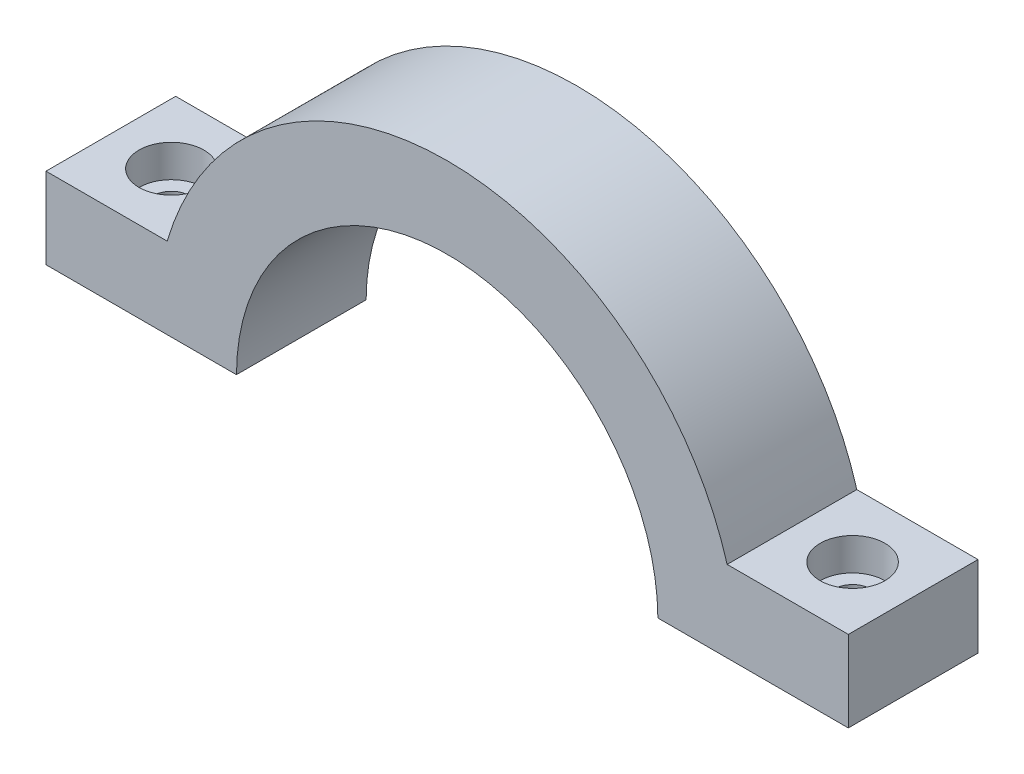
ISO-10303-21;
HEADER;
FILE_DESCRIPTION(('STEP AP214'),'2;1');
FILE_NAME('part.step','',(''),(''),'','','');
FILE_SCHEMA(('AUTOMOTIVE_DESIGN { 1 0 10303 214 1 1 1 1 }'));
ENDSEC;
DATA;
#1=APPLICATION_CONTEXT('core data for automotive mechanical design processes');
#2=APPLICATION_PROTOCOL_DEFINITION('international standard','automotive_design',2000,#1);
#3=PRODUCT_CONTEXT('',#1,'mechanical');
#4=PRODUCT('Part','Part','',(#3));
#5=PRODUCT_RELATED_PRODUCT_CATEGORY('part','',(#4));
#6=PRODUCT_DEFINITION_FORMATION('','',#4);
#7=PRODUCT_DEFINITION_CONTEXT('part definition',#1,'design');
#8=PRODUCT_DEFINITION('design','',#6,#7);
#9=PRODUCT_DEFINITION_SHAPE('','',#8);
#10=(LENGTH_UNIT() NAMED_UNIT(*) SI_UNIT(.MILLI.,.METRE.));
#11=(NAMED_UNIT(*) PLANE_ANGLE_UNIT() SI_UNIT($,.RADIAN.));
#12=(NAMED_UNIT(*) SI_UNIT($,.STERADIAN.) SOLID_ANGLE_UNIT());
#13=UNCERTAINTY_MEASURE_WITH_UNIT(LENGTH_MEASURE(1.E-05),#10,'distance_accuracy_value','');
#14=(GEOMETRIC_REPRESENTATION_CONTEXT(3) GLOBAL_UNCERTAINTY_ASSIGNED_CONTEXT((#13)) GLOBAL_UNIT_ASSIGNED_CONTEXT((#10,
#11,#12)) REPRESENTATION_CONTEXT('',''));
#15=CARTESIAN_POINT('',(0.,0.,0.));
#16=DIRECTION('',(0.,0.,1.));
#17=DIRECTION('',(1.,0.,0.));
#18=AXIS2_PLACEMENT_3D('',#15,#16,#17);
#19=CARTESIAN_POINT('',(0.,0.,-16.));
#20=DIRECTION('',(0.,0.,1.));
#21=DIRECTION('',(1.,0.,0.));
#22=AXIS2_PLACEMENT_3D('',#19,#20,#21);
#23=CYLINDRICAL_SURFACE('',#22,26.);
#24=CARTESIAN_POINT('',(0.,0.,0.));
#25=DIRECTION('',(0.,0.,-1.));
#26=DIRECTION('',(1.,0.,0.));
#27=AXIS2_PLACEMENT_3D('',#24,#25,#26);
#28=CIRCLE('',#27,26.);
#29=CARTESIAN_POINT('',(-25.9996995174944,0.125,0.));
#30=VERTEX_POINT('',#29);
#31=CARTESIAN_POINT('',(25.9996995174944,0.125,0.));
#32=VERTEX_POINT('',#31);
#33=EDGE_CURVE('E133',#30,#32,#28,.T.);
#34=ORIENTED_EDGE('',*,*,#33,.F.);
#35=DIRECTION('',(0.,0.,1.));
#36=VECTOR('',#35,1.);
#37=CARTESIAN_POINT('',(-25.9996995174944,0.125,-16.));
#38=LINE('',#37,#36);
#39=CARTESIAN_POINT('',(-25.9996995174944,0.125,-16.));
#40=VERTEX_POINT('',#39);
#41=EDGE_CURVE('E11',#40,#30,#38,.T.);
#42=ORIENTED_EDGE('',*,*,#41,.F.);
#43=CARTESIAN_POINT('',(0.,0.,-16.));
#44=DIRECTION('',(0.,0.,-1.));
#45=DIRECTION('',(1.,0.,0.));
#46=AXIS2_PLACEMENT_3D('',#43,#44,#45);
#47=CIRCLE('',#46,26.);
#48=CARTESIAN_POINT('',(25.9996995174944,0.125,-16.));
#49=VERTEX_POINT('',#48);
#50=EDGE_CURVE('E154',#40,#49,#47,.T.);
#51=ORIENTED_EDGE('',*,*,#50,.T.);
#52=DIRECTION('',(0.,0.,1.));
#53=VECTOR('',#52,1.);
#54=CARTESIAN_POINT('',(25.9996995174944,0.125,-16.));
#55=LINE('',#54,#53);
#56=EDGE_CURVE('E39',#49,#32,#55,.T.);
#57=ORIENTED_EDGE('',*,*,#56,.T.);
#58=EDGE_LOOP('',(#34,#42,#51,#57));
#59=FACE_BOUND('',#58,.T.);
#60=ADVANCED_FACE('F36',(#59),#23,.F.);
#61=CARTESIAN_POINT('',(-49.5,0.125,-16.));
#62=DIRECTION('',(0.,-1.,0.));
#63=DIRECTION('',(1.,0.,0.));
#64=AXIS2_PLACEMENT_3D('',#61,#62,#63);
#65=PLANE('',#64);
#66=CARTESIAN_POINT('',(-42.0234215993821,0.125,-8.));
#67=DIRECTION('',(0.,1.,0.));
#68=DIRECTION('',(0.,0.,1.));
#69=AXIS2_PLACEMENT_3D('',#66,#67,#68);
#70=CIRCLE('',#69,2.25);
#71=CARTESIAN_POINT('',(-42.0234215993821,0.125,-5.75000000000001));
#72=VERTEX_POINT('',#71);
#73=EDGE_CURVE('E224',#72,#72,#70,.T.);
#74=ORIENTED_EDGE('',*,*,#73,.T.);
#75=EDGE_LOOP('',(#74));
#76=FACE_BOUND('',#75,.T.);
#77=DIRECTION('',(1.,0.,0.));
#78=VECTOR('',#77,1.);
#79=CARTESIAN_POINT('',(-49.5,0.125,0.));
#80=LINE('',#79,#78);
#81=CARTESIAN_POINT('',(-49.5,0.125,0.));
#82=VERTEX_POINT('',#81);
#83=EDGE_CURVE('E152',#82,#30,#80,.T.);
#84=ORIENTED_EDGE('',*,*,#83,.F.);
#85=DIRECTION('',(0.,0.,1.));
#86=VECTOR('',#85,1.);
#87=CARTESIAN_POINT('',(-49.5,0.125,-16.));
#88=LINE('',#87,#86);
#89=CARTESIAN_POINT('',(-49.5,0.125,-16.));
#90=VERTEX_POINT('',#89);
#91=EDGE_CURVE('E45',#90,#82,#88,.T.);
#92=ORIENTED_EDGE('',*,*,#91,.F.);
#93=DIRECTION('',(1.,0.,0.));
#94=VECTOR('',#93,1.);
#95=CARTESIAN_POINT('',(-49.5,0.125,-16.));
#96=LINE('',#95,#94);
#97=EDGE_CURVE('E123',#90,#40,#96,.T.);
#98=ORIENTED_EDGE('',*,*,#97,.T.);
#99=ORIENTED_EDGE('',*,*,#41,.T.);
#100=EDGE_LOOP('',(#84,#92,#98,#99));
#101=FACE_BOUND('',#100,.T.);
#102=ADVANCED_FACE('F166',(#76,#101),#65,.T.);
#103=CARTESIAN_POINT('',(-49.5,0.125,-16.));
#104=DIRECTION('',(-1.,0.,0.));
#105=DIRECTION('',(0.,0.,1.));
#106=AXIS2_PLACEMENT_3D('',#103,#104,#105);
#107=PLANE('',#106);
#108=DIRECTION('',(0.,-1.,0.));
#109=VECTOR('',#108,1.);
#110=CARTESIAN_POINT('',(-49.5,0.125,0.));
#111=LINE('',#110,#109);
#112=CARTESIAN_POINT('',(-49.5,10.125,0.));
#113=VERTEX_POINT('',#112);
#114=EDGE_CURVE('E110',#113,#82,#111,.T.);
#115=ORIENTED_EDGE('',*,*,#114,.F.);
#116=DIRECTION('',(0.,0.,1.));
#117=VECTOR('',#116,1.);
#118=CARTESIAN_POINT('',(-49.5,10.125,-16.));
#119=LINE('',#118,#117);
#120=CARTESIAN_POINT('',(-49.5,10.125,-16.));
#121=VERTEX_POINT('',#120);
#122=EDGE_CURVE('E105',#121,#113,#119,.T.);
#123=ORIENTED_EDGE('',*,*,#122,.F.);
#124=DIRECTION('',(0.,-1.,0.));
#125=VECTOR('',#124,1.);
#126=CARTESIAN_POINT('',(-49.5,0.125,-16.));
#127=LINE('',#126,#125);
#128=EDGE_CURVE('E108',#121,#90,#127,.T.);
#129=ORIENTED_EDGE('',*,*,#128,.T.);
#130=ORIENTED_EDGE('',*,*,#91,.T.);
#131=EDGE_LOOP('',(#115,#123,#129,#130));
#132=FACE_BOUND('',#131,.T.);
#133=ADVANCED_FACE('F107',(#132),#107,.T.);
#134=CARTESIAN_POINT('',(-49.5,10.125,-16.));
#135=DIRECTION('',(0.,1.,0.));
#136=DIRECTION('',(0.,0.,1.));
#137=AXIS2_PLACEMENT_3D('',#134,#135,#136);
#138=PLANE('',#137);
#139=CARTESIAN_POINT('',(-42.0234215993821,10.125,-8.));
#140=DIRECTION('',(0.,1.,0.));
#141=DIRECTION('',(0.,0.,1.));
#142=AXIS2_PLACEMENT_3D('',#139,#140,#141);
#143=CIRCLE('',#142,4.);
#144=CARTESIAN_POINT('',(-42.0234215993821,10.125,-4.00000000000001));
#145=VERTEX_POINT('',#144);
#146=EDGE_CURVE('E232',#145,#145,#143,.T.);
#147=ORIENTED_EDGE('',*,*,#146,.F.);
#148=EDGE_LOOP('',(#147));
#149=FACE_BOUND('',#148,.T.);
#150=DIRECTION('',(-1.,0.,0.));
#151=VECTOR('',#150,1.);
#152=CARTESIAN_POINT('',(-49.5,10.125,0.));
#153=LINE('',#152,#151);
#154=CARTESIAN_POINT('',(-34.5468431987642,10.125,0.));
#155=VERTEX_POINT('',#154);
#156=EDGE_CURVE('E149',#155,#113,#153,.T.);
#157=ORIENTED_EDGE('',*,*,#156,.F.);
#158=DIRECTION('',(0.,0.,1.));
#159=VECTOR('',#158,1.);
#160=CARTESIAN_POINT('',(-34.5468431987642,10.125,-16.));
#161=LINE('',#160,#159);
#162=CARTESIAN_POINT('',(-34.5468431987642,10.125,-16.));
#163=VERTEX_POINT('',#162);
#164=EDGE_CURVE('E115',#163,#155,#161,.T.);
#165=ORIENTED_EDGE('',*,*,#164,.F.);
#166=DIRECTION('',(-1.,0.,0.));
#167=VECTOR('',#166,1.);
#168=CARTESIAN_POINT('',(-49.5,10.125,-16.));
#169=LINE('',#168,#167);
#170=EDGE_CURVE('E121',#163,#121,#169,.T.);
#171=ORIENTED_EDGE('',*,*,#170,.T.);
#172=ORIENTED_EDGE('',*,*,#122,.T.);
#173=EDGE_LOOP('',(#157,#165,#171,#172));
#174=FACE_BOUND('',#173,.T.);
#175=ADVANCED_FACE('F125',(#149,#174),#138,.T.);
#176=CARTESIAN_POINT('',(0.,0.,-16.));
#177=DIRECTION('',(0.,0.,1.));
#178=DIRECTION('',(1.,0.,0.));
#179=AXIS2_PLACEMENT_3D('',#176,#177,#178);
#180=CYLINDRICAL_SURFACE('',#179,36.);
#181=CARTESIAN_POINT('',(0.,0.,0.));
#182=DIRECTION('',(0.,0.,1.));
#183=DIRECTION('',(1.,0.,0.));
#184=AXIS2_PLACEMENT_3D('',#181,#182,#183);
#185=CIRCLE('',#184,36.);
#186=CARTESIAN_POINT('',(34.5468431987642,10.125,0.));
#187=VERTEX_POINT('',#186);
#188=EDGE_CURVE('E146',#187,#155,#185,.T.);
#189=ORIENTED_EDGE('',*,*,#188,.F.);
#190=DIRECTION('',(0.,0.,1.));
#191=VECTOR('',#190,1.);
#192=CARTESIAN_POINT('',(34.5468431987642,10.125,-16.));
#193=LINE('',#192,#191);
#194=CARTESIAN_POINT('',(34.5468431987642,10.125,-16.));
#195=VERTEX_POINT('',#194);
#196=EDGE_CURVE('E158',#195,#187,#193,.T.);
#197=ORIENTED_EDGE('',*,*,#196,.F.);
#198=CARTESIAN_POINT('',(0.,0.,-16.));
#199=DIRECTION('',(0.,0.,1.));
#200=DIRECTION('',(1.,0.,0.));
#201=AXIS2_PLACEMENT_3D('',#198,#199,#200);
#202=CIRCLE('',#201,36.);
#203=EDGE_CURVE('E126',#195,#163,#202,.T.);
#204=ORIENTED_EDGE('',*,*,#203,.T.);
#205=ORIENTED_EDGE('',*,*,#164,.T.);
#206=EDGE_LOOP('',(#189,#197,#204,#205));
#207=FACE_BOUND('',#206,.T.);
#208=ADVANCED_FACE('F181',(#207),#180,.T.);
#209=CARTESIAN_POINT('',(49.5,10.125,-16.));
#210=DIRECTION('',(0.,1.,0.));
#211=DIRECTION('',(0.,0.,1.));
#212=AXIS2_PLACEMENT_3D('',#209,#210,#211);
#213=PLANE('',#212);
#214=CARTESIAN_POINT('',(42.0234215993821,10.125,-8.));
#215=DIRECTION('',(0.,1.,0.));
#216=DIRECTION('',(0.,0.,1.));
#217=AXIS2_PLACEMENT_3D('',#214,#215,#216);
#218=CIRCLE('',#217,4.);
#219=CARTESIAN_POINT('',(42.0234215993821,10.125,-4.00000000000001));
#220=VERTEX_POINT('',#219);
#221=EDGE_CURVE('E221',#220,#220,#218,.T.);
#222=ORIENTED_EDGE('',*,*,#221,.F.);
#223=EDGE_LOOP('',(#222));
#224=FACE_BOUND('',#223,.T.);
#225=DIRECTION('',(-1.,0.,0.));
#226=VECTOR('',#225,1.);
#227=CARTESIAN_POINT('',(49.5,10.125,0.));
#228=LINE('',#227,#226);
#229=CARTESIAN_POINT('',(49.5,10.125,0.));
#230=VERTEX_POINT('',#229);
#231=EDGE_CURVE('E143',#230,#187,#228,.T.);
#232=ORIENTED_EDGE('',*,*,#231,.F.);
#233=DIRECTION('',(0.,0.,1.));
#234=VECTOR('',#233,1.);
#235=CARTESIAN_POINT('',(49.5,10.125,-16.));
#236=LINE('',#235,#234);
#237=CARTESIAN_POINT('',(49.5,10.125,-16.));
#238=VERTEX_POINT('',#237);
#239=EDGE_CURVE('E160',#238,#230,#236,.T.);
#240=ORIENTED_EDGE('',*,*,#239,.F.);
#241=DIRECTION('',(-1.,0.,0.));
#242=VECTOR('',#241,1.);
#243=CARTESIAN_POINT('',(49.5,10.125,-16.));
#244=LINE('',#243,#242);
#245=EDGE_CURVE('E128',#238,#195,#244,.T.);
#246=ORIENTED_EDGE('',*,*,#245,.T.);
#247=ORIENTED_EDGE('',*,*,#196,.T.);
#248=EDGE_LOOP('',(#232,#240,#246,#247));
#249=FACE_BOUND('',#248,.T.);
#250=ADVANCED_FACE('F185',(#224,#249),#213,.T.);
#251=CARTESIAN_POINT('',(49.5,0.125,-16.));
#252=DIRECTION('',(1.,0.,0.));
#253=DIRECTION('',(0.,0.,-1.));
#254=AXIS2_PLACEMENT_3D('',#251,#252,#253);
#255=PLANE('',#254);
#256=DIRECTION('',(0.,1.,0.));
#257=VECTOR('',#256,1.);
#258=CARTESIAN_POINT('',(49.5,0.125,0.));
#259=LINE('',#258,#257);
#260=CARTESIAN_POINT('',(49.5,0.125,0.));
#261=VERTEX_POINT('',#260);
#262=EDGE_CURVE('E140',#261,#230,#259,.T.);
#263=ORIENTED_EDGE('',*,*,#262,.F.);
#264=DIRECTION('',(0.,0.,1.));
#265=VECTOR('',#264,1.);
#266=CARTESIAN_POINT('',(49.5,0.125,-16.));
#267=LINE('',#266,#265);
#268=CARTESIAN_POINT('',(49.5,0.125,-16.));
#269=VERTEX_POINT('',#268);
#270=EDGE_CURVE('E161',#269,#261,#267,.T.);
#271=ORIENTED_EDGE('',*,*,#270,.F.);
#272=DIRECTION('',(0.,1.,0.));
#273=VECTOR('',#272,1.);
#274=CARTESIAN_POINT('',(49.5,0.125,-16.));
#275=LINE('',#274,#273);
#276=EDGE_CURVE('E211',#269,#238,#275,.T.);
#277=ORIENTED_EDGE('',*,*,#276,.T.);
#278=ORIENTED_EDGE('',*,*,#239,.T.);
#279=EDGE_LOOP('',(#263,#271,#277,#278));
#280=FACE_BOUND('',#279,.T.);
#281=ADVANCED_FACE('F189',(#280),#255,.T.);
#282=CARTESIAN_POINT('',(25.9996995174944,0.125,-16.));
#283=DIRECTION('',(0.,-1.,0.));
#284=DIRECTION('',(1.,0.,0.));
#285=AXIS2_PLACEMENT_3D('',#282,#283,#284);
#286=PLANE('',#285);
#287=CARTESIAN_POINT('',(42.0234215993821,0.125,-8.));
#288=DIRECTION('',(0.,1.,0.));
#289=DIRECTION('',(0.,0.,1.));
#290=AXIS2_PLACEMENT_3D('',#287,#288,#289);
#291=CIRCLE('',#290,2.25);
#292=CARTESIAN_POINT('',(42.0234215993821,0.125,-5.75000000000001));
#293=VERTEX_POINT('',#292);
#294=EDGE_CURVE('E137',#293,#293,#291,.T.);
#295=ORIENTED_EDGE('',*,*,#294,.T.);
#296=EDGE_LOOP('',(#295));
#297=FACE_BOUND('',#296,.T.);
#298=DIRECTION('',(1.,0.,0.));
#299=VECTOR('',#298,1.);
#300=CARTESIAN_POINT('',(25.9996995174944,0.125,0.));
#301=LINE('',#300,#299);
#302=EDGE_CURVE('E136',#32,#261,#301,.T.);
#303=ORIENTED_EDGE('',*,*,#302,.F.);
#304=ORIENTED_EDGE('',*,*,#56,.F.);
#305=DIRECTION('',(1.,0.,0.));
#306=VECTOR('',#305,1.);
#307=CARTESIAN_POINT('',(25.9996995174944,0.125,-16.));
#308=LINE('',#307,#306);
#309=EDGE_CURVE('E209',#49,#269,#308,.T.);
#310=ORIENTED_EDGE('',*,*,#309,.T.);
#311=ORIENTED_EDGE('',*,*,#270,.T.);
#312=EDGE_LOOP('',(#303,#304,#310,#311));
#313=FACE_BOUND('',#312,.T.);
#314=ADVANCED_FACE('F163',(#297,#313),#286,.T.);
#315=CARTESIAN_POINT('',(0.,0.,-16.));
#316=DIRECTION('',(0.,0.,1.));
#317=DIRECTION('',(1.,0.,0.));
#318=AXIS2_PLACEMENT_3D('',#315,#316,#317);
#319=PLANE('',#318);
#320=ORIENTED_EDGE('',*,*,#50,.F.);
#321=ORIENTED_EDGE('',*,*,#97,.F.);
#322=ORIENTED_EDGE('',*,*,#128,.F.);
#323=ORIENTED_EDGE('',*,*,#170,.F.);
#324=ORIENTED_EDGE('',*,*,#203,.F.);
#325=ORIENTED_EDGE('',*,*,#245,.F.);
#326=ORIENTED_EDGE('',*,*,#276,.F.);
#327=ORIENTED_EDGE('',*,*,#309,.F.);
#328=EDGE_LOOP('',(#320,#321,#322,#323,#324,#325,#326,#327));
#329=FACE_BOUND('',#328,.T.);
#330=ADVANCED_FACE('F119',(#329),#319,.F.);
#331=CARTESIAN_POINT('',(0.,0.,0.));
#332=DIRECTION('',(0.,0.,1.));
#333=DIRECTION('',(1.,0.,0.));
#334=AXIS2_PLACEMENT_3D('',#331,#332,#333);
#335=PLANE('',#334);
#336=ORIENTED_EDGE('',*,*,#33,.T.);
#337=ORIENTED_EDGE('',*,*,#302,.T.);
#338=ORIENTED_EDGE('',*,*,#262,.T.);
#339=ORIENTED_EDGE('',*,*,#231,.T.);
#340=ORIENTED_EDGE('',*,*,#188,.T.);
#341=ORIENTED_EDGE('',*,*,#156,.T.);
#342=ORIENTED_EDGE('',*,*,#114,.T.);
#343=ORIENTED_EDGE('',*,*,#83,.T.);
#344=EDGE_LOOP('',(#336,#337,#338,#339,#340,#341,#342,#343));
#345=FACE_BOUND('',#344,.T.);
#346=ADVANCED_FACE('F165',(#345),#335,.T.);
#347=CARTESIAN_POINT('',(42.0234215993821,10.125,-8.));
#348=DIRECTION('',(0.,1.,0.));
#349=DIRECTION('',(0.,0.,1.));
#350=AXIS2_PLACEMENT_3D('',#347,#348,#349);
#351=CYLINDRICAL_SURFACE('',#350,2.25);
#352=ORIENTED_EDGE('',*,*,#294,.F.);
#353=EDGE_LOOP('',(#352));
#354=FACE_BOUND('',#353,.T.);
#355=CARTESIAN_POINT('',(42.0234215993821,6.125,-8.));
#356=DIRECTION('',(0.,1.,0.));
#357=DIRECTION('',(0.,0.,1.));
#358=AXIS2_PLACEMENT_3D('',#355,#356,#357);
#359=CIRCLE('',#358,2.25000000000001);
#360=CARTESIAN_POINT('',(42.0234215993821,6.125,-5.74999999999999));
#361=VERTEX_POINT('',#360);
#362=EDGE_CURVE('E201',#361,#361,#359,.T.);
#363=ORIENTED_EDGE('',*,*,#362,.T.);
#364=EDGE_LOOP('',(#363));
#365=FACE_BOUND('',#364,.T.);
#366=ADVANCED_FACE('F259',(#354,#365),#351,.F.);
#367=CARTESIAN_POINT('',(44.2734215993821,6.125,-8.));
#368=DIRECTION('',(0.,-1.,0.));
#369=DIRECTION('',(0.,0.,-1.));
#370=AXIS2_PLACEMENT_3D('',#367,#368,#369);
#371=PLANE('',#370);
#372=ORIENTED_EDGE('',*,*,#362,.F.);
#373=EDGE_LOOP('',(#372));
#374=FACE_BOUND('',#373,.T.);
#375=CARTESIAN_POINT('',(42.0234215993821,6.125,-8.));
#376=DIRECTION('',(0.,1.,0.));
#377=DIRECTION('',(0.,0.,1.));
#378=AXIS2_PLACEMENT_3D('',#375,#376,#377);
#379=CIRCLE('',#378,4.);
#380=CARTESIAN_POINT('',(42.0234215993821,6.125,-4.00000000000001));
#381=VERTEX_POINT('',#380);
#382=EDGE_CURVE('E204',#381,#381,#379,.T.);
#383=ORIENTED_EDGE('',*,*,#382,.T.);
#384=EDGE_LOOP('',(#383));
#385=FACE_BOUND('',#384,.T.);
#386=ADVANCED_FACE('F255',(#374,#385),#371,.F.);
#387=CARTESIAN_POINT('',(42.0234215993821,10.125,-8.));
#388=DIRECTION('',(0.,1.,0.));
#389=DIRECTION('',(0.,0.,1.));
#390=AXIS2_PLACEMENT_3D('',#387,#388,#389);
#391=CYLINDRICAL_SURFACE('',#390,4.);
#392=ORIENTED_EDGE('',*,*,#382,.F.);
#393=EDGE_LOOP('',(#392));
#394=FACE_BOUND('',#393,.T.);
#395=ORIENTED_EDGE('',*,*,#221,.T.);
#396=EDGE_LOOP('',(#395));
#397=FACE_BOUND('',#396,.T.);
#398=ADVANCED_FACE('F251',(#394,#397),#391,.F.);
#399=CARTESIAN_POINT('',(-42.0234215993821,10.125,-8.));
#400=DIRECTION('',(0.,1.,0.));
#401=DIRECTION('',(0.,0.,1.));
#402=AXIS2_PLACEMENT_3D('',#399,#400,#401);
#403=CYLINDRICAL_SURFACE('',#402,2.25);
#404=ORIENTED_EDGE('',*,*,#73,.F.);
#405=EDGE_LOOP('',(#404));
#406=FACE_BOUND('',#405,.T.);
#407=CARTESIAN_POINT('',(-42.0234215993821,6.125,-8.));
#408=DIRECTION('',(0.,1.,0.));
#409=DIRECTION('',(0.,0.,1.));
#410=AXIS2_PLACEMENT_3D('',#407,#408,#409);
#411=CIRCLE('',#410,2.25000000000001);
#412=CARTESIAN_POINT('',(-42.0234215993821,6.125,-5.74999999999999));
#413=VERTEX_POINT('',#412);
#414=EDGE_CURVE('E226',#413,#413,#411,.T.);
#415=ORIENTED_EDGE('',*,*,#414,.T.);
#416=EDGE_LOOP('',(#415));
#417=FACE_BOUND('',#416,.T.);
#418=ADVANCED_FACE('F244',(#406,#417),#403,.F.);
#419=CARTESIAN_POINT('',(-39.7734215993821,6.125,-8.));
#420=DIRECTION('',(0.,-1.,0.));
#421=DIRECTION('',(0.,0.,-1.));
#422=AXIS2_PLACEMENT_3D('',#419,#420,#421);
#423=PLANE('',#422);
#424=ORIENTED_EDGE('',*,*,#414,.F.);
#425=EDGE_LOOP('',(#424));
#426=FACE_BOUND('',#425,.T.);
#427=CARTESIAN_POINT('',(-42.0234215993821,6.125,-8.));
#428=DIRECTION('',(0.,1.,0.));
#429=DIRECTION('',(0.,0.,1.));
#430=AXIS2_PLACEMENT_3D('',#427,#428,#429);
#431=CIRCLE('',#430,4.);
#432=CARTESIAN_POINT('',(-42.0234215993821,6.125,-4.00000000000001));
#433=VERTEX_POINT('',#432);
#434=EDGE_CURVE('E229',#433,#433,#431,.T.);
#435=ORIENTED_EDGE('',*,*,#434,.T.);
#436=EDGE_LOOP('',(#435));
#437=FACE_BOUND('',#436,.T.);
#438=ADVANCED_FACE('F238',(#426,#437),#423,.F.);
#439=CARTESIAN_POINT('',(-42.0234215993821,10.125,-8.));
#440=DIRECTION('',(0.,1.,0.));
#441=DIRECTION('',(0.,0.,1.));
#442=AXIS2_PLACEMENT_3D('',#439,#440,#441);
#443=CYLINDRICAL_SURFACE('',#442,4.);
#444=ORIENTED_EDGE('',*,*,#434,.F.);
#445=EDGE_LOOP('',(#444));
#446=FACE_BOUND('',#445,.T.);
#447=ORIENTED_EDGE('',*,*,#146,.T.);
#448=EDGE_LOOP('',(#447));
#449=FACE_BOUND('',#448,.T.);
#450=ADVANCED_FACE('F236',(#446,#449),#443,.F.);
#451=CLOSED_SHELL('',(#60,#102,#133,#175,#208,#250,#281,#314,#330,#346,#366,#386,#398,#418,#438,#450));
#452=MANIFOLD_SOLID_BREP('B2',#451);
#453=ADVANCED_BREP_SHAPE_REPRESENTATION('',(#18,#452),#14);
#454=SHAPE_DEFINITION_REPRESENTATION(#9,#453);
ENDSEC;
END-ISO-10303-21;
